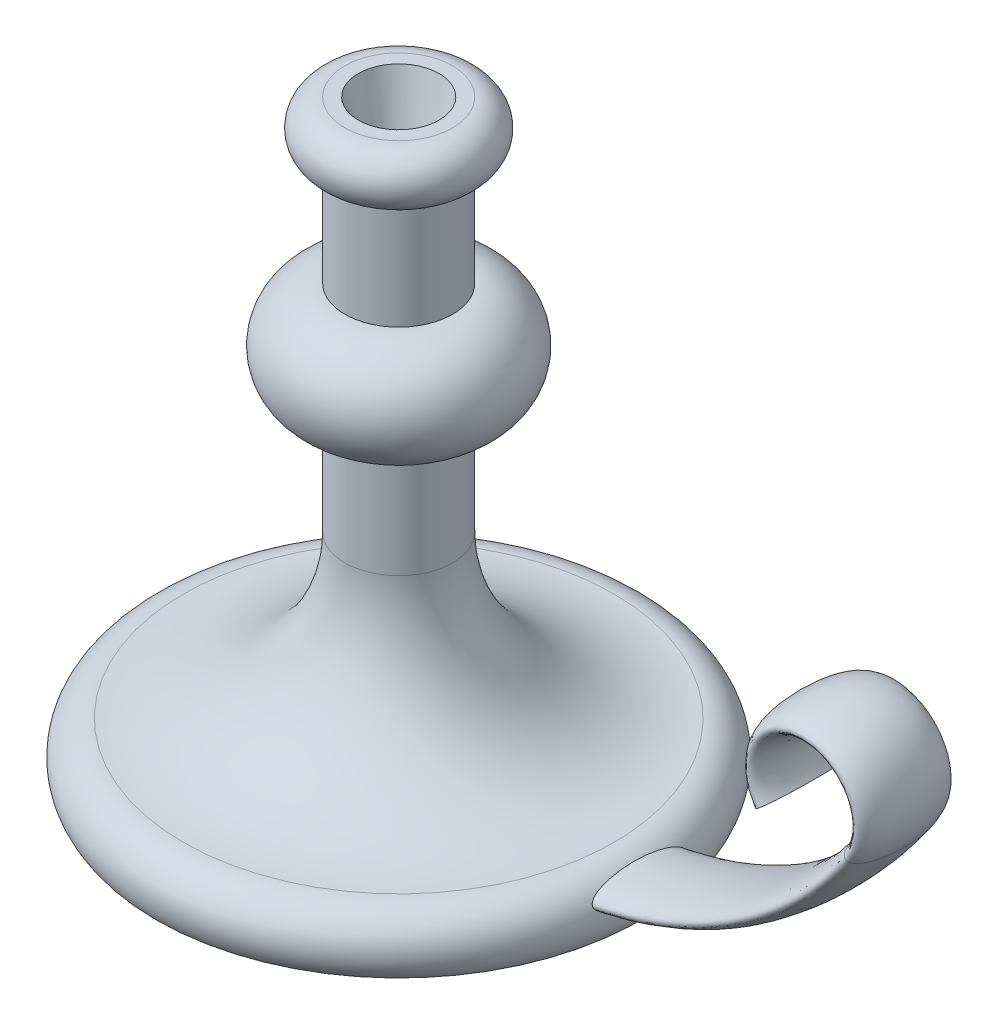
ISO-10303-21;
HEADER;
FILE_DESCRIPTION(('STEP AP214'),'2;1');
FILE_NAME('part.step','',(''),(''),'','','');
FILE_SCHEMA(('AUTOMOTIVE_DESIGN { 1 0 10303 214 1 1 1 1 }'));
ENDSEC;
DATA;
#1=APPLICATION_CONTEXT('core data for automotive mechanical design processes');
#2=APPLICATION_PROTOCOL_DEFINITION('international standard','automotive_design',2000,#1);
#3=PRODUCT_CONTEXT('',#1,'mechanical');
#4=PRODUCT('Part','Part','',(#3));
#5=PRODUCT_RELATED_PRODUCT_CATEGORY('part','',(#4));
#6=PRODUCT_DEFINITION_FORMATION('','',#4);
#7=PRODUCT_DEFINITION_CONTEXT('part definition',#1,'design');
#8=PRODUCT_DEFINITION('design','',#6,#7);
#9=PRODUCT_DEFINITION_SHAPE('','',#8);
#10=(LENGTH_UNIT() NAMED_UNIT(*) SI_UNIT(.MILLI.,.METRE.));
#11=(NAMED_UNIT(*) PLANE_ANGLE_UNIT() SI_UNIT($,.RADIAN.));
#12=(NAMED_UNIT(*) SI_UNIT($,.STERADIAN.) SOLID_ANGLE_UNIT());
#13=UNCERTAINTY_MEASURE_WITH_UNIT(LENGTH_MEASURE(1.E-05),#10,'distance_accuracy_value','');
#14=(GEOMETRIC_REPRESENTATION_CONTEXT(3) GLOBAL_UNCERTAINTY_ASSIGNED_CONTEXT((#13)) GLOBAL_UNIT_ASSIGNED_CONTEXT((#10,
#11,#12)) REPRESENTATION_CONTEXT('',''));
#15=CARTESIAN_POINT('',(0.,0.,0.));
#16=DIRECTION('',(0.,0.,1.));
#17=DIRECTION('',(1.,0.,0.));
#18=AXIS2_PLACEMENT_3D('',#15,#16,#17);
#19=CARTESIAN_POINT('',(0.,0.,0.));
#20=DIRECTION('',(0.,-1.,0.));
#21=DIRECTION('',(0.,0.,-1.));
#22=AXIS2_PLACEMENT_3D('',#19,#20,#21);
#23=PLANE('',#22);
#24=CARTESIAN_POINT('',(0.,0.,0.));
#25=DIRECTION('',(0.,-1.,0.));
#26=DIRECTION('',(0.,0.,-1.));
#27=AXIS2_PLACEMENT_3D('',#24,#25,#26);
#28=CIRCLE('',#27,90.);
#29=CARTESIAN_POINT('',(0.,0.,-90.));
#30=VERTEX_POINT('',#29);
#31=EDGE_CURVE('E76',#30,#30,#28,.T.);
#32=ORIENTED_EDGE('',*,*,#31,.T.);
#33=EDGE_LOOP('',(#32));
#34=FACE_BOUND('',#33,.T.);
#35=ADVANCED_FACE('F36',(#34),#23,.T.);
#36=CARTESIAN_POINT('',(20.,220.,0.));
#37=DIRECTION('',(0.,1.,0.));
#38=DIRECTION('',(0.,0.,1.));
#39=AXIS2_PLACEMENT_3D('',#36,#37,#38);
#40=PLANE('',#39);
#41=CARTESIAN_POINT('',(0.,220.,0.));
#42=DIRECTION('',(0.,1.,0.));
#43=DIRECTION('',(0.,0.,1.));
#44=AXIS2_PLACEMENT_3D('',#41,#42,#43);
#45=CIRCLE('',#44,15.);
#46=CARTESIAN_POINT('',(0.,220.,15.));
#47=VERTEX_POINT('',#46);
#48=EDGE_CURVE('E92',#47,#47,#45,.T.);
#49=ORIENTED_EDGE('',*,*,#48,.F.);
#50=EDGE_LOOP('',(#49));
#51=FACE_BOUND('',#50,.T.);
#52=CARTESIAN_POINT('',(0.,220.,0.));
#53=DIRECTION('',(0.,-1.,0.));
#54=DIRECTION('',(0.,0.,-1.));
#55=AXIS2_PLACEMENT_3D('',#52,#53,#54);
#56=CIRCLE('',#55,20.);
#57=CARTESIAN_POINT('',(0.,220.,-20.));
#58=VERTEX_POINT('',#57);
#59=EDGE_CURVE('E48',#58,#58,#56,.T.);
#60=ORIENTED_EDGE('',*,*,#59,.F.);
#61=EDGE_LOOP('',(#60));
#62=FACE_BOUND('',#61,.T.);
#63=ADVANCED_FACE('F99',(#51,#62),#40,.T.);
#64=CARTESIAN_POINT('',(0.,210.,0.));
#65=DIRECTION('',(0.,-1.,0.));
#66=DIRECTION('',(0.,0.,-1.));
#67=AXIS2_PLACEMENT_3D('',#64,#65,#66);
#68=TOROIDAL_SURFACE('',#67,20.,10.);
#69=ORIENTED_EDGE('',*,*,#59,.T.);
#70=EDGE_LOOP('',(#69));
#71=FACE_BOUND('',#70,.T.);
#72=CARTESIAN_POINT('',(0.,200.,0.));
#73=DIRECTION('',(0.,-1.,0.));
#74=DIRECTION('',(0.,0.,-1.));
#75=AXIS2_PLACEMENT_3D('',#72,#73,#74);
#76=CIRCLE('',#75,20.);
#77=CARTESIAN_POINT('',(0.,200.,-20.));
#78=VERTEX_POINT('',#77);
#79=EDGE_CURVE('E53',#78,#78,#76,.T.);
#80=ORIENTED_EDGE('',*,*,#79,.F.);
#81=EDGE_LOOP('',(#80));
#82=FACE_BOUND('',#81,.T.);
#83=ADVANCED_FACE('F102',(#71,#82),#68,.T.);
#84=CARTESIAN_POINT('',(0.,0.,0.));
#85=DIRECTION('',(0.,-1.,0.));
#86=DIRECTION('',(0.,0.,-1.));
#87=AXIS2_PLACEMENT_3D('',#84,#85,#86);
#88=CYLINDRICAL_SURFACE('',#87,20.);
#89=ORIENTED_EDGE('',*,*,#79,.T.);
#90=EDGE_LOOP('',(#89));
#91=FACE_BOUND('',#90,.T.);
#92=CARTESIAN_POINT('',(0.,160.,0.));
#93=DIRECTION('',(0.,-1.,0.));
#94=DIRECTION('',(0.,0.,-1.));
#95=AXIS2_PLACEMENT_3D('',#92,#93,#94);
#96=CIRCLE('',#95,20.);
#97=CARTESIAN_POINT('',(0.,160.,-20.));
#98=VERTEX_POINT('',#97);
#99=EDGE_CURVE('E58',#98,#98,#96,.T.);
#100=ORIENTED_EDGE('',*,*,#99,.F.);
#101=EDGE_LOOP('',(#100));
#102=FACE_BOUND('',#101,.T.);
#103=ADVANCED_FACE('F107',(#91,#102),#88,.T.);
#104=CARTESIAN_POINT('',(0.,140.,0.));
#105=DIRECTION('',(0.,-1.,0.));
#106=DIRECTION('',(0.,0.,-1.));
#107=AXIS2_PLACEMENT_3D('',#104,#105,#106);
#108=TOROIDAL_SURFACE('',#107,20.,20.);
#109=ORIENTED_EDGE('',*,*,#99,.T.);
#110=EDGE_LOOP('',(#109));
#111=FACE_BOUND('',#110,.T.);
#112=CARTESIAN_POINT('',(0.,120.,0.));
#113=DIRECTION('',(0.,-1.,0.));
#114=DIRECTION('',(0.,0.,-1.));
#115=AXIS2_PLACEMENT_3D('',#112,#113,#114);
#116=CIRCLE('',#115,20.);
#117=CARTESIAN_POINT('',(0.,120.,-20.));
#118=VERTEX_POINT('',#117);
#119=EDGE_CURVE('E64',#118,#118,#116,.T.);
#120=ORIENTED_EDGE('',*,*,#119,.F.);
#121=EDGE_LOOP('',(#120));
#122=FACE_BOUND('',#121,.T.);
#123=ADVANCED_FACE('F113',(#111,#122),#108,.T.);
#124=CARTESIAN_POINT('',(0.,0.,0.));
#125=DIRECTION('',(0.,-1.,0.));
#126=DIRECTION('',(0.,0.,-1.));
#127=AXIS2_PLACEMENT_3D('',#124,#125,#126);
#128=CYLINDRICAL_SURFACE('',#127,20.);
#129=ORIENTED_EDGE('',*,*,#119,.T.);
#130=EDGE_LOOP('',(#129));
#131=FACE_BOUND('',#130,.T.);
#132=CARTESIAN_POINT('',(0.,80.,0.));
#133=DIRECTION('',(0.,-1.,0.));
#134=DIRECTION('',(0.,0.,-1.));
#135=AXIS2_PLACEMENT_3D('',#132,#133,#134);
#136=CIRCLE('',#135,20.);
#137=CARTESIAN_POINT('',(0.,80.,-20.));
#138=VERTEX_POINT('',#137);
#139=EDGE_CURVE('E68',#138,#138,#136,.T.);
#140=ORIENTED_EDGE('',*,*,#139,.F.);
#141=EDGE_LOOP('',(#140));
#142=FACE_BOUND('',#141,.T.);
#143=ADVANCED_FACE('F117',(#131,#142),#128,.T.);
#144=CARTESIAN_POINT('',(0.,80.,0.));
#145=DIRECTION('',(0.,-1.,0.));
#146=DIRECTION('',(0.,0.,-1.));
#147=AXIS2_PLACEMENT_3D('',#144,#145,#146);
#148=TOROIDAL_SURFACE('',#147,79.9966978185343,59.9966978185343);
#149=ORIENTED_EDGE('',*,*,#139,.T.);
#150=EDGE_LOOP('',(#149));
#151=FACE_BOUND('',#150,.T.);
#152=CARTESIAN_POINT('',(0.,20.0033023721403,0.));
#153=DIRECTION('',(0.,-1.,0.));
#154=DIRECTION('',(0.,0.,-1.));
#155=AXIS2_PLACEMENT_3D('',#152,#153,#154);
#156=CIRCLE('',#155,80.0014810911586);
#157=CARTESIAN_POINT('',(0.,20.0033023721403,-80.0014810911586));
#158=VERTEX_POINT('',#157);
#159=EDGE_CURVE('E72',#158,#158,#156,.T.);
#160=ORIENTED_EDGE('',*,*,#159,.F.);
#161=EDGE_LOOP('',(#160));
#162=FACE_BOUND('',#161,.T.);
#163=ADVANCED_FACE('F121',(#151,#162),#148,.F.);
#164=CARTESIAN_POINT('',(0.,7.50330241186642,0.));
#165=DIRECTION('',(0.,-1.,0.));
#166=DIRECTION('',(0.,0.,-1.));
#167=AXIS2_PLACEMENT_3D('',#164,#165,#166);
#168=TOROIDAL_SURFACE('',#167,80.0024776611363,12.5);
#169=CARTESIAN_POINT('',(89.5635193070544,12.9421939297971,-17.5));
#170=CARTESIAN_POINT('',(89.5428508662169,12.9841694255431,-17.4999996712968));
#171=CARTESIAN_POINT('',(89.5222827504617,13.0261943416728,-17.4978448519816));
#172=CARTESIAN_POINT('',(89.4815061309814,13.1099920891137,-17.4892870899943));
#173=CARTESIAN_POINT('',(89.4612977606126,13.1517648232999,-17.4828826043248));
#174=CARTESIAN_POINT('',(89.4014130938948,13.2762378625445,-17.4575191647379));
#175=CARTESIAN_POINT('',(89.362477463698,13.358092553138,-17.4324102309369));
#176=CARTESIAN_POINT('',(89.2773908857415,13.5386773335524,-17.3597560498356));
#177=CARTESIAN_POINT('',(89.2320911569119,13.6360738100751,-17.308008951089));
#178=CARTESIAN_POINT('',(89.1461929932614,13.8225141826515,-17.1881964219695));
#179=CARTESIAN_POINT('',(89.1056047112789,13.9115399648438,-17.1200966868827));
#180=CARTESIAN_POINT('',(89.0339928185431,14.069762320482,-16.9825847822263));
#181=CARTESIAN_POINT('',(89.0024204364326,14.1400051953203,-16.9146278403201));
#182=CARTESIAN_POINT('',(88.9420210265698,14.275047723494,-16.7723251939668));
#183=CARTESIAN_POINT('',(88.9131962273865,14.3398429532943,-16.6979743948726));
#184=CARTESIAN_POINT('',(88.857848444012,14.4647192833905,-16.5443167450951));
#185=CARTESIAN_POINT('',(88.831331398334,14.5247881855226,-16.4649979618145));
#186=CARTESIAN_POINT('',(88.7803338866122,14.6406150223384,-16.302711171432));
#187=CARTESIAN_POINT('',(88.7558527718116,14.6963743298869,-16.2197443397763));
#188=CARTESIAN_POINT('',(88.7090833738586,14.8030757275497,-16.0525784062557));
#189=CARTESIAN_POINT('',(88.6867616955933,14.8540904310482,-15.9684346794762));
#190=CARTESIAN_POINT('',(88.6435567568719,14.9529152677852,-15.7979181729676));
#191=CARTESIAN_POINT('',(88.6226737380737,15.0007248626113,-15.7115450220855));
#192=CARTESIAN_POINT('',(88.5618344688207,15.1400231697327,-15.449459862925));
#193=CARTESIAN_POINT('',(88.523755275393,15.2272274349473,-15.2710294827606));
#194=CARTESIAN_POINT('',(88.4514551007999,15.3924435203473,-14.90909498963));
#195=CARTESIAN_POINT('',(88.4172374154512,15.4704474905601,-14.7255867064991));
#196=CARTESIAN_POINT('',(88.3517813935115,15.6190734076376,-14.3541481478763));
#197=CARTESIAN_POINT('',(88.3205567138584,15.6896616454402,-14.1662020667064));
#198=CARTESIAN_POINT('',(88.2607350385904,15.824163375824,-13.7877799170375));
#199=CARTESIAN_POINT('',(88.2321352069696,15.8880840827578,-13.5973068397803));
#200=CARTESIAN_POINT('',(88.1771327817965,16.0102079029598,-13.2142873987815));
#201=CARTESIAN_POINT('',(88.1507296388112,16.0684124466091,-13.0217415671648));
#202=CARTESIAN_POINT('',(88.0932981663833,16.1940746307496,-12.5854510660438));
#203=CARTESIAN_POINT('',(88.0628162781229,16.2600862648378,-12.3412188838489));
#204=CARTESIAN_POINT('',(88.004414624895,16.3852648079611,-11.8506904500774));
#205=CARTESIAN_POINT('',(87.9764951213889,16.4444310186619,-11.6043939906576));
#206=CARTESIAN_POINT('',(87.9229160589551,16.5567393992401,-11.1100650129252));
#207=CARTESIAN_POINT('',(87.8972576074273,16.6098786208849,-10.8620317074445));
#208=CARTESIAN_POINT('',(87.8480117275941,16.7107251818931,-10.364654450682));
#209=CARTESIAN_POINT('',(87.8244243984557,16.7584322611938,-10.1153104372475));
#210=CARTESIAN_POINT('',(87.7566549972386,16.8939580994207,-9.36690754856548));
#211=CARTESIAN_POINT('',(87.7153346146715,16.9744538373251,-8.8662524150183));
#212=CARTESIAN_POINT('',(87.639709021477,17.1187960252231,-7.86217991754262));
#213=CARTESIAN_POINT('',(87.6054023539052,17.18264593378,-7.35876314963853));
#214=CARTESIAN_POINT('',(87.5437534776894,17.295342871041,-6.35284464486036));
#215=CARTESIAN_POINT('',(87.5163715423629,17.3442758261203,-5.85035490381053));
#216=CARTESIAN_POINT('',(87.4682865601632,17.4289825041075,-4.84387758701639));
#217=CARTESIAN_POINT('',(87.4475845997155,17.4647540865936,-4.3398897810664));
#218=CARTESIAN_POINT('',(87.4129342798064,17.5240275558654,-3.33092042700004));
#219=CARTESIAN_POINT('',(87.3989865378949,17.5475283207244,-2.82593879225287));
#220=CARTESIAN_POINT('',(87.3779444315141,17.5827963136636,-1.8159711011595));
#221=CARTESIAN_POINT('',(87.3708426997481,17.594576155592,-1.31098563570045));
#222=CARTESIAN_POINT('',(87.363521875743,17.6067171217284,-0.300881233987524));
#223=CARTESIAN_POINT('',(87.3633020778606,17.607079416642,0.204237683271568));
#224=CARTESIAN_POINT('',(87.3697450026092,17.5963984748476,1.21425991047338));
#225=CARTESIAN_POINT('',(87.3764069695486,17.5853564904519,1.71916323799996));
#226=CARTESIAN_POINT('',(87.3941510408288,17.5556427642524,2.60781423109229));
#227=CARTESIAN_POINT('',(87.4037960254974,17.5394255498715,2.99167485170588));
#228=CARTESIAN_POINT('',(87.4270041511251,17.5000108525612,3.758936163594));
#229=CARTESIAN_POINT('',(87.4405674311186,17.4768131219381,4.14233683806322));
#230=CARTESIAN_POINT('',(87.4715787966712,17.4231052022774,4.90854443211101));
#231=CARTESIAN_POINT('',(87.4890276294284,17.3925936066855,5.29135122320815));
#232=CARTESIAN_POINT('',(87.5278930652534,17.3236187692189,6.05816165352866));
#233=CARTESIAN_POINT('',(87.5493308017778,17.2851130419144,6.4421604236646));
#234=CARTESIAN_POINT('',(87.5961226047551,17.1996414602893,7.20891347422254));
#235=CARTESIAN_POINT('',(87.6214759976141,17.1526770608478,7.59166795715252));
#236=CARTESIAN_POINT('',(87.6761687414299,17.0494949301845,8.35542208973923));
#237=CARTESIAN_POINT('',(87.7055057187933,16.9932827050324,8.73642264574231));
#238=CARTESIAN_POINT('',(87.7607749956292,16.8853302963732,9.40452820299931));
#239=CARTESIAN_POINT('',(87.7858155796857,16.8357947453463,9.69206349132689));
#240=CARTESIAN_POINT('',(87.8384669750274,16.7301231167074,10.2657356239857));
#241=CARTESIAN_POINT('',(87.8660781745421,16.6739860417563,10.5518722501924));
#242=CARTESIAN_POINT('',(87.9241337967817,16.5542555525604,11.1226337635456));
#243=CARTESIAN_POINT('',(87.9545813127668,16.490653977491,11.4072566337307));
#244=CARTESIAN_POINT('',(88.0187159088336,16.3548401285039,11.9748109387135));
#245=CARTESIAN_POINT('',(88.0524104820798,16.2826078409337,12.2577367794469));
#246=CARTESIAN_POINT('',(88.1232802107733,16.1287641326856,12.8185246006667));
#247=CARTESIAN_POINT('',(88.1604303895483,16.0472191741961,13.0964078547594));
#248=CARTESIAN_POINT('',(88.2391815265889,15.8725038782058,13.6477663305386));
#249=CARTESIAN_POINT('',(88.2807801565261,15.7793396180661,13.9212437728197));
#250=CARTESIAN_POINT('',(88.3474069128906,15.6289262250885,14.3263467015459));
#251=CARTESIAN_POINT('',(88.3702851845886,15.5770916754189,14.4603422661774));
#252=CARTESIAN_POINT('',(88.4176934567155,15.4693620659757,14.7263886835338));
#253=CARTESIAN_POINT('',(88.4422232764383,15.4134674503861,14.8584397470979));
#254=CARTESIAN_POINT('',(88.493156623474,15.2971815517212,15.1198022465526));
#255=CARTESIAN_POINT('',(88.5195555504065,15.2368012921327,15.2491194568985));
#256=CARTESIAN_POINT('',(88.5746384518047,15.1107200390848,15.5046176277364));
#257=CARTESIAN_POINT('',(88.6033218573937,15.0450203701876,15.6307993588151));
#258=CARTESIAN_POINT('',(88.6615780157753,14.9116770257294,15.8712852223459));
#259=CARTESIAN_POINT('',(88.6909828335859,14.8444121849714,15.9858385402911));
#260=CARTESIAN_POINT('',(88.7527780930906,14.7033596134388,16.2102135659272));
#261=CARTESIAN_POINT('',(88.7851709884576,14.6295665240376,16.3200312744001));
#262=CARTESIAN_POINT('',(88.8533359715461,14.4749033101332,16.5321568064684));
#263=CARTESIAN_POINT('',(88.8890804672135,14.3940913163537,16.6345154212068));
#264=CARTESIAN_POINT('',(88.964962790947,14.2235865907003,16.829714349781));
#265=CARTESIAN_POINT('',(89.0050928678396,14.1339095530469,16.922570912629));
#266=CARTESIAN_POINT('',(89.0644103871168,14.0025182854035,17.0415868655511));
#267=CARTESIAN_POINT('',(89.0813329896829,13.9651512353254,17.0737005534585));
#268=CARTESIAN_POINT('',(89.1160229894535,13.8888379348456,17.1354833518964));
#269=CARTESIAN_POINT('',(89.1337903295358,13.8498917912502,17.1651526273512));
#270=CARTESIAN_POINT('',(89.1884769857364,13.7305178405165,17.2499661894751));
#271=CARTESIAN_POINT('',(89.2267725138476,13.6475732355723,17.3008988011892));
#272=CARTESIAN_POINT('',(89.2871593449007,13.5181346073128,17.3661469133476));
#273=CARTESIAN_POINT('',(89.3079290784603,13.4738354399507,17.3861339118031));
#274=CARTESIAN_POINT('',(89.3503327151956,13.3839028661103,17.4216740504118));
#275=CARTESIAN_POINT('',(89.3719661019359,13.3382702612323,17.4372297963349));
#276=CARTESIAN_POINT('',(89.4159569540428,13.2460389410397,17.4634116241098));
#277=CARTESIAN_POINT('',(89.4383132116591,13.1994418796906,17.4740455157179));
#278=CARTESIAN_POINT('',(89.4836120417305,13.1056304184995,17.4900505899597));
#279=CARTESIAN_POINT('',(89.5065545280245,13.0584161098699,17.4954225414534));
#280=CARTESIAN_POINT('',(89.5503839467664,12.9688203136257,17.5004393734379));
#281=CARTESIAN_POINT('',(89.5712344982808,12.9264505806998,17.5006251575276));
#282=CARTESIAN_POINT('',(89.61306732163,12.8419646890026,17.4966409867777));
#283=CARTESIAN_POINT('',(89.6340496348495,12.7998486189726,17.4924695875954));
#284=CARTESIAN_POINT('',(89.6759766337306,12.7162153208466,17.4799124473928));
#285=CARTESIAN_POINT('',(89.6969213020847,12.6746983261466,17.4715251071633));
#286=CARTESIAN_POINT('',(89.7386239975212,12.592549701038,17.450791354541));
#287=CARTESIAN_POINT('',(89.7593819171955,12.551918563119,17.4384427969875));
#288=CARTESIAN_POINT('',(89.805154858961,12.4628793889059,17.4069736730132));
#289=CARTESIAN_POINT('',(89.8300920511784,12.4147470839655,17.3869583398835));
#290=CARTESIAN_POINT('',(89.879342333635,12.3203923899263,17.3421806137594));
#291=CARTESIAN_POINT('',(89.9036549487296,12.274171439484,17.3174147213735));
#292=CARTESIAN_POINT('',(89.9755634656381,12.1384557081084,17.2369451107995));
#293=CARTESIAN_POINT('',(90.0220829831318,12.0519993411227,17.1751040090089));
#294=CARTESIAN_POINT('',(90.105168695789,11.8996308489044,17.0500497103883));
#295=CARTESIAN_POINT('',(90.1421780339245,11.8325866361904,16.9884494096681));
#296=CARTESIAN_POINT('',(90.214107277005,11.7036689875471,16.8588603775827));
#297=CARTESIAN_POINT('',(90.2490255241035,11.6417996393033,16.7908666843912));
#298=CARTESIAN_POINT('',(90.3169750223572,11.5226085844403,16.6499200859936));
#299=CARTESIAN_POINT('',(90.3500026089781,11.4652956308214,16.5769581127797));
#300=CARTESIAN_POINT('',(90.4142886514837,11.3547900621249,16.4272903260251));
#301=CARTESIAN_POINT('',(90.4455475593551,11.3015963930693,16.3505854783951));
#302=CARTESIAN_POINT('',(90.5101545567171,11.1926280252577,16.184785387672));
#303=CARTESIAN_POINT('',(90.5433008624058,11.1373140264373,16.0953104759967));
#304=CARTESIAN_POINT('',(90.6078305372918,11.0306252527265,15.9134297455803));
#305=CARTESIAN_POINT('',(90.6392137295845,10.9792508729358,15.8210236341831));
#306=CARTESIAN_POINT('',(90.7003506850112,10.8800404110733,15.6340177811216));
#307=CARTESIAN_POINT('',(90.7301069604525,10.8321988311017,15.5394217623314));
#308=CARTESIAN_POINT('',(90.7881954740153,10.7395696226087,15.3483317695772));
#309=CARTESIAN_POINT('',(90.8165277903153,10.6947818263795,15.251837900215));
#310=CARTESIAN_POINT('',(90.8806084602952,10.594264167935,15.0266784260125));
#311=CARTESIAN_POINT('',(90.9158871078666,10.5395224903537,14.8974382025836));
#312=CARTESIAN_POINT('',(90.9844538251563,10.4341218989964,14.636776185541));
#313=CARTESIAN_POINT('',(91.0177416125853,10.3834635638559,14.5053540859127));
#314=CARTESIAN_POINT('',(91.1149857360779,10.2367553193583,14.1081522412042));
#315=CARTESIAN_POINT('',(91.176245267255,10.1460929743855,13.8397145632092));
#316=CARTESIAN_POINT('',(91.2927354231768,9.97621136259865,13.2978516526874));
#317=CARTESIAN_POINT('',(91.3479624303093,9.89699895303066,13.0244235409247));
#318=CARTESIAN_POINT('',(91.4534074253878,9.74771586331621,12.4725090733675));
#319=CARTESIAN_POINT('',(91.5035967866943,9.67769680040785,12.1940033884287));
#320=CARTESIAN_POINT('',(91.5991516948562,9.54592106064929,11.6344767019351));
#321=CARTESIAN_POINT('',(91.6445209480756,9.48415802585043,11.3534578158192));
#322=CARTESIAN_POINT('',(91.7308862991805,9.36778184689838,10.7893347322844));
#323=CARTESIAN_POINT('',(91.7718830998298,9.31316755343986,10.506230877816));
#324=CARTESIAN_POINT('',(91.853669770176,9.20519425093241,9.9103088498182));
#325=CARTESIAN_POINT('',(91.8940401325344,9.15249074634804,9.59731485340543));
#326=CARTESIAN_POINT('',(91.9702059089579,9.05390589427781,8.96969234379932));
#327=CARTESIAN_POINT('',(92.0060010938347,9.00802488853852,8.65506374954359));
#328=CARTESIAN_POINT('',(92.0732643844887,8.92244593744808,8.02441111383106));
#329=CARTESIAN_POINT('',(92.1047311764327,8.88274986897949,7.70838667859412));
#330=CARTESIAN_POINT('',(92.1635093390033,8.80907055503235,7.0752833060214));
#331=CARTESIAN_POINT('',(92.1908205567921,8.77508751966863,6.75820433033874));
#332=CARTESIAN_POINT('',(92.2666038261825,8.68128507213578,5.80746716310989));
#333=CARTESIAN_POINT('',(92.3091127838216,8.6293764990503,5.17253302148244));
#334=CARTESIAN_POINT('',(92.378986498572,8.54456707596828,3.90058113838133));
#335=CARTESIAN_POINT('',(92.4063505159885,8.51166715437088,3.26356329666578));
#336=CARTESIAN_POINT('',(92.4463497861323,8.46371049949053,1.98909728639888));
#337=CARTESIAN_POINT('',(92.4590011167971,8.44863428826217,1.35165035071004));
#338=CARTESIAN_POINT('',(92.4698204938321,8.43573576133353,0.0764243050041191));
#339=CARTESIAN_POINT('',(92.4679876794365,8.43791447106112,-0.561354822502305));
#340=CARTESIAN_POINT('',(92.4498073834772,8.45960669522234,-1.83653014229254));
#341=CARTESIAN_POINT('',(92.4334571959616,8.47912344136293,-2.47392624101703));
#342=CARTESIAN_POINT('',(92.3859929737701,8.53616859945461,-3.74732927674616));
#343=CARTESIAN_POINT('',(92.3548804110625,8.5736952156314,-4.38333634590165));
#344=CARTESIAN_POINT('',(92.294353688261,8.64747828039564,-5.37474839830967));
#345=CARTESIAN_POINT('',(92.2701699485718,8.67708492790004,-5.73098275229686));
#346=CARTESIAN_POINT('',(92.2168329848368,8.74282228604296,-6.44247339669011));
#347=CARTESIAN_POINT('',(92.1876799144002,8.77895279502153,-6.79772971698379));
#348=CARTESIAN_POINT('',(92.1242205990798,8.85823132464219,-7.50697460622178));
#349=CARTESIAN_POINT('',(92.0899147108004,8.90137885968323,-7.8609632611614));
#350=CARTESIAN_POINT('',(92.0159018887449,8.99534656623559,-8.56735422811242));
#351=CARTESIAN_POINT('',(91.9761951304858,9.04616648841634,-8.91975659129064));
#352=CARTESIAN_POINT('',(91.9036995961564,9.13997950392137,-9.51811149859572));
#353=CARTESIAN_POINT('',(91.8723610605813,9.18081118771825,-9.76457983895773));
#354=CARTESIAN_POINT('',(91.8067024063653,9.26708506594589,-10.2563069893118));
#355=CARTESIAN_POINT('',(91.7723823671483,9.31252713756635,-10.5015658313397));
#356=CARTESIAN_POINT('',(91.7005992633445,9.40846777164539,-10.9904670044953));
#357=CARTESIAN_POINT('',(91.6631382798035,9.458962990346,-11.234110292318));
#358=CARTESIAN_POINT('',(91.5848202298031,9.56563902668489,-11.7195854977562));
#359=CARTESIAN_POINT('',(91.5439633073427,9.62181960326713,-11.9614174917029));
#360=CARTESIAN_POINT('',(91.4409215467425,9.76514932357934,-12.5422818105373));
#361=CARTESIAN_POINT('',(91.3768957448418,9.85550763406904,-12.8802208791568));
#362=CARTESIAN_POINT('',(91.2743788354455,10.0030395881525,-13.3826208982005));
#363=CARTESIAN_POINT('',(91.2390902684045,10.0542703012807,-13.5494923042439));
#364=CARTESIAN_POINT('',(91.1661504103493,10.1612596104872,-13.8812578404267));
#365=CARTESIAN_POINT('',(91.128499225353,10.2170180034276,-14.0461520588937));
#366=CARTESIAN_POINT('',(91.0473361317082,10.3385679995988,-14.3870867110014));
#367=CARTESIAN_POINT('',(91.0035972087094,10.4048083311013,-14.5629143978865));
#368=CARTESIAN_POINT('',(90.9125964488027,10.5444853142586,-14.9108617574437));
#369=CARTESIAN_POINT('',(90.8653334380116,10.6179243664129,-15.0829801697148));
#370=CARTESIAN_POINT('',(90.7668782064195,10.7732016842564,-15.4215628970081));
#371=CARTESIAN_POINT('',(90.7156989905734,10.8550124304653,-15.5880434861442));
#372=CARTESIAN_POINT('',(90.6085379752862,11.0291705042194,-15.9137299702539));
#373=CARTESIAN_POINT('',(90.5525603567164,11.1215086818585,-16.0729420166201));
#374=CARTESIAN_POINT('',(90.4472194264476,11.2985527002434,-16.3479691480305));
#375=CARTESIAN_POINT('',(90.3989701376856,11.3807258168007,-16.4658282022841));
#376=CARTESIAN_POINT('',(90.2980074172399,11.5554672152909,-16.6922483214413));
#377=CARTESIAN_POINT('',(90.2452845861904,11.6480575247613,-16.8007887944444));
#378=CARTESIAN_POINT('',(90.16204820138,11.7968775512328,-16.9533348331988));
#379=CARTESIAN_POINT('',(90.13338529287,11.8485556491126,-17.0027960117767));
#380=CARTESIAN_POINT('',(90.0746853358407,11.9553824720017,-17.0970091835708));
#381=CARTESIAN_POINT('',(90.0446479710402,12.010531996942,-17.141760084989));
#382=CARTESIAN_POINT('',(89.9833124249727,12.1242516894904,-17.2251932053627));
#383=CARTESIAN_POINT('',(89.9520193833072,12.1828082821713,-17.2638975106606));
#384=CARTESIAN_POINT('',(89.8881692144044,12.3035034069137,-17.3339787118746));
#385=CARTESIAN_POINT('',(89.8556132467902,12.3656386772977,-17.3653621524111));
#386=CARTESIAN_POINT('',(89.8014283645917,12.4701309209309,-17.4095081536665));
#387=CARTESIAN_POINT('',(89.7800946385489,12.511536055416,-17.4249038513984));
#388=CARTESIAN_POINT('',(89.7371303912727,12.5954750494268,-17.4516576211179));
#389=CARTESIAN_POINT('',(89.7154999849544,12.6380084775709,-17.4630172129894));
#390=CARTESIAN_POINT('',(89.6721129383754,12.7238871940295,-17.4813430001592));
#391=CARTESIAN_POINT('',(89.6503564850836,12.7672314246358,-17.4883145572374));
#392=CARTESIAN_POINT('',(89.6068698642128,12.8544303972612,-17.4976431634003));
#393=CARTESIAN_POINT('',(89.5851396959031,12.8982851247122,-17.5000003438426));
#394=CARTESIAN_POINT('',(89.5635193070544,12.9421939297971,-17.5));
#395=B_SPLINE_CURVE_WITH_KNOTS('',3,(#169,#170,#171,#172,#173,#174,#175,#176,#177,#178,#179,
#180,#181,#182,#183,#184,#185,#186,#187,#188,#189,#190,#191,#192,#193,#194,#195,#196,#197,#198,
#199,#200,#201,#202,#203,#204,#205,#206,#207,#208,#209,#210,#211,#212,#213,#214,#215,#216,#217,
#218,#219,#220,#221,#222,#223,#224,#225,#226,#227,#228,#229,#230,#231,#232,#233,#234,#235,#236,
#237,#238,#239,#240,#241,#242,#243,#244,#245,#246,#247,#248,#249,#250,#251,#252,#253,#254,#255,
#256,#257,#258,#259,#260,#261,#262,#263,#264,#265,#266,#267,#268,#269,#270,#271,#272,#273,#274,
#275,#276,#277,#278,#279,#280,#281,#282,#283,#284,#285,#286,#287,#288,#289,#290,#291,#292,#293,
#294,#295,#296,#297,#298,#299,#300,#301,#302,#303,#304,#305,#306,#307,#308,#309,#310,#311,#312,
#313,#314,#315,#316,#317,#318,#319,#320,#321,#322,#323,#324,#325,#326,#327,#328,#329,#330,#331,
#332,#333,#334,#335,#336,#337,#338,#339,#340,#341,#342,#343,#344,#345,#346,#347,#348,#349,#350,
#351,#352,#353,#354,#355,#356,#357,#358,#359,#360,#361,#362,#363,#364,#365,#366,#367,#368,#369,
#370,#371,#372,#373,#374,#375,#376,#377,#378,#379,#380,#381,#382,#383,#384,#385,#386,#387,#388,
#389,#390,#391,#392,#393,#394),.UNSPECIFIED.,.T.,.F.,(4,2,2,2,2,2,2,2,2,2,2,2,2,2,2,2,2,2,2,2,2,
2,2,2,2,2,2,2,2,2,2,2,2,2,2,2,2,2,2,2,2,2,2,2,2,2,2,2,2,2,2,2,2,2,2,2,2,2,2,2,2,2,2,2,2,2,2,2,2,
2,2,2,2,2,2,2,2,2,2,2,2,2,2,2,2,2,2,2,2,2,2,2,2,2,2,2,2,2,2,2,2,2,2,2,2,2,2,2,2,2,2,2,4),(0.,
0.140311327804437,0.280673628684598,0.561399716298859,0.917121556244441,1.27359625428717,
1.58128284390528,1.88921691204279,2.19792129635946,2.5065269309517,2.80912874188309,
3.11178125886974,3.71798103286044,4.32469434959696,4.93405599275887,5.54275130607212,
6.15129391263847,6.91563249523464,7.68004898304588,8.44483780357178,9.20966322281704,
10.7355309607319,12.2610814105351,13.7776705063866,15.2945061347975,16.8114804239268,
18.3268204008966,19.8420050010046,21.3570232352538,22.5099185188978,23.6628547162155,
24.8160128167561,25.9754639880779,27.1347159256162,28.2932801367223,29.1717342069711,
30.0503211624094,30.9298777719005,31.8115150712858,32.6872130740337,33.5624549574729,
33.9988391405495,34.4351756535199,34.870473245044,35.3056627764672,35.7136231932669,
36.1219216424052,36.527112891864,36.931599238145,37.0878060844404,37.2440023828348,
37.5564752507727,37.7148618544241,37.8731551266564,38.0311963584822,38.1892144943138,
38.3306823942886,38.4721972036962,38.6137657336722,38.7554110585748,38.9284980264732,
39.1017129880093,39.4484639726933,39.7429304862937,40.0376274479134,40.3328775004451,
40.6280517576834,40.9587751514339,41.2895316697767,41.6197621004289,41.9499743808513,
42.3840286916879,42.8181444030283,43.6873117287405,44.556997451903,45.431374437845,
46.3050741403569,47.1786332049244,48.1383815081423,49.0981778700398,50.0582649270669,
51.0183872866058,52.9332332678812,54.8481727640013,56.7610176532414,58.6739762201506,
60.5872914260007,62.5004158937357,63.5751755661778,64.6499020222676,65.72455413541,
66.7991713329555,67.5544733300272,68.3097552128424,69.0645405760076,69.8192939500868,
70.8856717708679,71.4198752423463,71.9540547595993,72.532634517157,73.1114078696795,
73.6883363276497,74.2647671175402,74.7189811836958,75.1741744236114,75.4051779157494,
75.6362348349517,75.8664269795776,76.0964125442917,76.243425855659,76.3903837471251,
76.5371617190031,76.6839355124808),.UNSPECIFIED.);
#396=CARTESIAN_POINT('',(89.5635193070544,12.9421939297971,-17.5));
#397=VERTEX_POINT('',#396);
#398=EDGE_CURVE('E10',#397,#397,#395,.T.);
#399=ORIENTED_EDGE('',*,*,#398,.F.);
#400=EDGE_LOOP('',(#399));
#401=FACE_BOUND('',#400,.T.);
#402=ORIENTED_EDGE('',*,*,#159,.T.);
#403=EDGE_LOOP('',(#402));
#404=FACE_BOUND('',#403,.T.);
#405=ORIENTED_EDGE('',*,*,#31,.F.);
#406=EDGE_LOOP('',(#405));
#407=FACE_BOUND('',#406,.T.);
#408=ADVANCED_FACE('F124',(#401,#404,#407),#168,.T.);
#409=CARTESIAN_POINT('',(150.634185358261,75.,0.));
#410=DIRECTION('',(0.566666666666667,-0.823947139620552,0.));
#411=DIRECTION('',(0.,0.,-1.));
#412=AXIS2_PLACEMENT_3D('',#409,#410,#411);
#413=PLANE('',#412);
#414=CARTESIAN_POINT('',(150.634185358261,75.,0.));
#415=DIRECTION('',(0.566666666666667,-0.823947139620552,0.));
#416=DIRECTION('',(0.,0.,-1.));
#417=AXIS2_PLACEMENT_3D('',#414,#415,#416);
#418=ELLIPSE('',#417,17.5,5.);
#419=CARTESIAN_POINT('',(150.634185358261,75.,-17.5));
#420=VERTEX_POINT('',#419);
#421=EDGE_CURVE('E80',#420,#420,#418,.T.);
#422=ORIENTED_EDGE('',*,*,#421,.T.);
#423=EDGE_LOOP('',(#422));
#424=FACE_BOUND('',#423,.T.);
#425=ADVANCED_FACE('F129',(#424),#413,.T.);
#426=CARTESIAN_POINT('',(60.,10.,-17.5));
#427=CARTESIAN_POINT('',(110.410191303973,10.,-17.5));
#428=CARTESIAN_POINT('',(155.026295870831,33.4646670673665,-17.5));
#429=CARTESIAN_POINT('',(183.592070943083,75.,-17.5));
#430=CARTESIAN_POINT('',(60.,20.,-17.5));
#431=CARTESIAN_POINT('',(107.049511883708,20.,-17.5));
#432=CARTESIAN_POINT('',(148.691209479443,41.9003559295421,-17.5));
#433=CARTESIAN_POINT('',(175.352599546877,80.6666666666666,-17.5));
#434=CARTESIAN_POINT('',(60.,20.,17.5));
#435=CARTESIAN_POINT('',(107.049511883708,20.,17.5));
#436=CARTESIAN_POINT('',(148.691209479443,41.9003559295421,17.5));
#437=CARTESIAN_POINT('',(175.352599546877,80.6666666666666,17.5));
#438=CARTESIAN_POINT('',(60.,10.,17.5));
#439=CARTESIAN_POINT('',(110.410191303973,10.,17.5));
#440=CARTESIAN_POINT('',(155.026295870831,33.4646670673665,17.5));
#441=CARTESIAN_POINT('',(183.592070943083,75.,17.5));
#442=CARTESIAN_POINT('',(60.,0.,17.5));
#443=CARTESIAN_POINT('',(113.770870724238,0.,17.5));
#444=CARTESIAN_POINT('',(161.36138226222,25.0289782051909,17.5));
#445=CARTESIAN_POINT('',(191.831542339288,69.3333333333333,17.5));
#446=CARTESIAN_POINT('',(60.,0.,-17.5));
#447=CARTESIAN_POINT('',(113.770870724238,0.,-17.5));
#448=CARTESIAN_POINT('',(161.36138226222,25.0289782051909,-17.5));
#449=CARTESIAN_POINT('',(191.831542339288,69.3333333333333,-17.5));
#450=CARTESIAN_POINT('',(60.,10.,-17.5));
#451=CARTESIAN_POINT('',(110.410191303973,10.,-17.5));
#452=CARTESIAN_POINT('',(155.026295870831,33.4646670673665,-17.5));
#453=CARTESIAN_POINT('',(183.592070943083,75.,-17.5));
#454=(BOUNDED_SURFACE() B_SPLINE_SURFACE(3,3,((#426,#427,#428,#429),(#430,#431,#432,#433),(#434,
#435,#436,#437),(#438,#439,#440,#441),(#442,#443,#444,#445),(#446,#447,#448,#449),(#450,#451,
#452,#453)),.UNSPECIFIED.,.T.,.F.,.F.) B_SPLINE_SURFACE_WITH_KNOTS((4,3,4),(4,4),(0.,0.5,1.),
(0.,1.),.UNSPECIFIED.) GEOMETRIC_REPRESENTATION_ITEM() RATIONAL_B_SPLINE_SURFACE(((1.,
0.923374135437856,0.923374135437856,1.),(0.333333333333333,0.307791378479285,0.307791378479285,
0.333333333333333),(0.333333333333333,0.307791378479285,0.307791378479285,0.333333333333333),
(1.,0.923374135437856,0.923374135437856,1.),(0.333333333333333,0.307791378479285,
0.307791378479285,0.333333333333333),(0.333333333333333,0.307791378479285,0.307791378479285,
0.333333333333333),(1.,0.923374135437856,0.923374135437856,1.))) REPRESENTATION_ITEM('') SURFACE());
#455=CARTESIAN_POINT('',(183.592070943083,75.,0.));
#456=DIRECTION('',(0.566666666666667,0.823947139620552,0.));
#457=DIRECTION('',(0.,0.,-1.));
#458=AXIS2_PLACEMENT_3D('',#455,#456,#457);
#459=ELLIPSE('',#458,17.5,5.);
#460=CARTESIAN_POINT('',(183.592070943083,75.,-17.5));
#461=VERTEX_POINT('',#460);
#462=EDGE_CURVE('E84',#461,#461,#459,.T.);
#463=ORIENTED_EDGE('',*,*,#398,.T.);
#464=EDGE_LOOP('',(#463));
#465=FACE_BOUND('',#464,.T.);
#466=ORIENTED_EDGE('',*,*,#462,.F.);
#467=EDGE_LOOP('',(#466));
#468=FACE_BOUND('',#467,.T.);
#469=ADVANCED_FACE('F134',(#465,#468),#454,.T.);
#470=CARTESIAN_POINT('',(183.592070943083,75.,-17.5));
#471=CARTESIAN_POINT('',(193.981461744242,90.10642735238,-17.5));
#472=CARTESIAN_POINT('',(185.447347211541,106.333333333333,-17.5));
#473=CARTESIAN_POINT('',(167.113128150672,106.333333333333,-17.5));
#474=CARTESIAN_POINT('',(148.778909089802,106.333333333333,-17.5));
#475=CARTESIAN_POINT('',(140.244794557101,90.1064273523801,-17.5));
#476=CARTESIAN_POINT('',(150.634185358261,75.,-17.5));
#477=CARTESIAN_POINT('',(175.352599546877,80.6666666666667,-17.5));
#478=CARTESIAN_POINT('',(180.547294947457,88.2198803428567,-17.5));
#479=CARTESIAN_POINT('',(176.280237681107,96.3333333333333,-17.5));
#480=CARTESIAN_POINT('',(167.113128150672,96.3333333333333,-17.5));
#481=CARTESIAN_POINT('',(157.946018620237,96.3333333333333,-17.5));
#482=CARTESIAN_POINT('',(153.678961353886,88.2198803428567,-17.5));
#483=CARTESIAN_POINT('',(158.873656754466,80.6666666666667,-17.5));
#484=CARTESIAN_POINT('',(175.352599546877,80.6666666666667,17.5));
#485=CARTESIAN_POINT('',(180.547294947457,88.2198803428567,17.5));
#486=CARTESIAN_POINT('',(176.280237681107,96.3333333333333,17.5));
#487=CARTESIAN_POINT('',(167.113128150672,96.3333333333333,17.5));
#488=CARTESIAN_POINT('',(157.946018620237,96.3333333333333,17.5));
#489=CARTESIAN_POINT('',(153.678961353886,88.2198803428567,17.5));
#490=CARTESIAN_POINT('',(158.873656754466,80.6666666666667,17.5));
#491=CARTESIAN_POINT('',(183.592070943083,75.,17.5));
#492=CARTESIAN_POINT('',(193.981461744242,90.10642735238,17.5));
#493=CARTESIAN_POINT('',(185.447347211541,106.333333333333,17.5));
#494=CARTESIAN_POINT('',(167.113128150672,106.333333333333,17.5));
#495=CARTESIAN_POINT('',(148.778909089802,106.333333333333,17.5));
#496=CARTESIAN_POINT('',(140.244794557101,90.1064273523801,17.5));
#497=CARTESIAN_POINT('',(150.634185358261,75.,17.5));
#498=CARTESIAN_POINT('',(191.831542339288,69.3333333333333,17.5));
#499=CARTESIAN_POINT('',(207.415628541027,91.9929743619034,17.5));
#500=CARTESIAN_POINT('',(194.614456741976,116.333333333333,17.5));
#501=CARTESIAN_POINT('',(167.113128150672,116.333333333333,17.5));
#502=CARTESIAN_POINT('',(139.611799559367,116.333333333333,17.5));
#503=CARTESIAN_POINT('',(126.810627760316,91.9929743619035,17.5));
#504=CARTESIAN_POINT('',(142.394713962055,69.3333333333333,17.5));
#505=CARTESIAN_POINT('',(191.831542339288,69.3333333333333,-17.5));
#506=CARTESIAN_POINT('',(207.415628541027,91.9929743619034,-17.5));
#507=CARTESIAN_POINT('',(194.614456741976,116.333333333333,-17.5));
#508=CARTESIAN_POINT('',(167.113128150672,116.333333333333,-17.5));
#509=CARTESIAN_POINT('',(139.611799559367,116.333333333333,-17.5));
#510=CARTESIAN_POINT('',(126.810627760316,91.9929743619035,-17.5));
#511=CARTESIAN_POINT('',(142.394713962055,69.3333333333333,-17.5));
#512=CARTESIAN_POINT('',(183.592070943083,75.,-17.5));
#513=CARTESIAN_POINT('',(193.981461744242,90.10642735238,-17.5));
#514=CARTESIAN_POINT('',(185.447347211541,106.333333333333,-17.5));
#515=CARTESIAN_POINT('',(167.113128150672,106.333333333333,-17.5));
#516=CARTESIAN_POINT('',(148.778909089802,106.333333333333,-17.5));
#517=CARTESIAN_POINT('',(140.244794557101,90.1064273523801,-17.5));
#518=CARTESIAN_POINT('',(150.634185358261,75.,-17.5));
#519=(BOUNDED_SURFACE() B_SPLINE_SURFACE(3,3,((#470,#471,#472,#473,#474,#475,#476),(#477,#478,
#479,#480,#481,#482,#483),(#484,#485,#486,#487,#488,#489,#490),(#491,#492,#493,#494,#495,#496,
#497),(#498,#499,#500,#501,#502,#503,#504),(#505,#506,#507,#508,#509,#510,#511),(#512,#513,#514,
#515,#516,#517,#518)),.UNSPECIFIED.,.T.,.F.,.F.) B_SPLINE_SURFACE_WITH_KNOTS((4,3,4),(4,3,4),
(0.,0.5,1.),(0.,0.5,1.),
.UNSPECIFIED.) GEOMETRIC_REPRESENTATION_ITEM() RATIONAL_B_SPLINE_SURFACE(((1.,0.643649778750421,
0.643649778750421,1.,0.643649778750421,0.643649778750421,1.),(0.333333333333333,
0.21454992625014,0.21454992625014,0.333333333333333,0.21454992625014,0.21454992625014,
0.333333333333333),(0.333333333333333,0.21454992625014,0.21454992625014,0.333333333333333,
0.21454992625014,0.21454992625014,0.333333333333333),(1.,0.643649778750421,0.643649778750421,1.,
0.643649778750421,0.643649778750421,1.),(0.333333333333333,0.21454992625014,0.21454992625014,
0.333333333333333,0.21454992625014,0.21454992625014,0.333333333333333),(0.333333333333333,
0.21454992625014,0.21454992625014,0.333333333333333,0.21454992625014,0.21454992625014,
0.333333333333333),(1.,0.643649778750421,0.643649778750421,1.,0.643649778750421,
0.643649778750421,1.))) REPRESENTATION_ITEM('') SURFACE());
#520=ORIENTED_EDGE('',*,*,#421,.F.);
#521=EDGE_LOOP('',(#520));
#522=FACE_BOUND('',#521,.T.);
#523=ORIENTED_EDGE('',*,*,#462,.T.);
#524=EDGE_LOOP('',(#523));
#525=FACE_BOUND('',#524,.T.);
#526=ADVANCED_FACE('F131',(#522,#525),#519,.T.);
#527=CARTESIAN_POINT('',(0.,220.,0.));
#528=DIRECTION('',(0.,1.,0.));
#529=DIRECTION('',(0.,0.,1.));
#530=AXIS2_PLACEMENT_3D('',#527,#528,#529);
#531=CONICAL_SURFACE('',#530,15.,0.26179938779915);
#532=CARTESIAN_POINT('',(0.,195.,0.));
#533=DIRECTION('',(0.,1.,0.));
#534=DIRECTION('',(0.,0.,1.));
#535=AXIS2_PLACEMENT_3D('',#532,#533,#534);
#536=CIRCLE('',#535,8.30127018922192);
#537=CARTESIAN_POINT('',(0.,195.,8.30127018922192));
#538=VERTEX_POINT('',#537);
#539=EDGE_CURVE('E88',#538,#538,#536,.T.);
#540=ORIENTED_EDGE('',*,*,#539,.F.);
#541=EDGE_LOOP('',(#540));
#542=FACE_BOUND('',#541,.T.);
#543=ORIENTED_EDGE('',*,*,#48,.T.);
#544=EDGE_LOOP('',(#543));
#545=FACE_BOUND('',#544,.T.);
#546=ADVANCED_FACE('F97',(#542,#545),#531,.F.);
#547=CARTESIAN_POINT('',(0.,195.,0.));
#548=DIRECTION('',(0.,1.,0.));
#549=DIRECTION('',(0.,0.,1.));
#550=AXIS2_PLACEMENT_3D('',#547,#548,#549);
#551=PLANE('',#550);
#552=ORIENTED_EDGE('',*,*,#539,.T.);
#553=EDGE_LOOP('',(#552));
#554=FACE_BOUND('',#553,.T.);
#555=ADVANCED_FACE('F157',(#554),#551,.T.);
#556=CLOSED_SHELL('',(#35,#63,#83,#103,#123,#143,#163,#408,#425,#469,#526,#546,#555));
#557=MANIFOLD_SOLID_BREP('B2',#556);
#558=ADVANCED_BREP_SHAPE_REPRESENTATION('',(#18,#557),#14);
#559=SHAPE_DEFINITION_REPRESENTATION(#9,#558);
ENDSEC;
END-ISO-10303-21;
